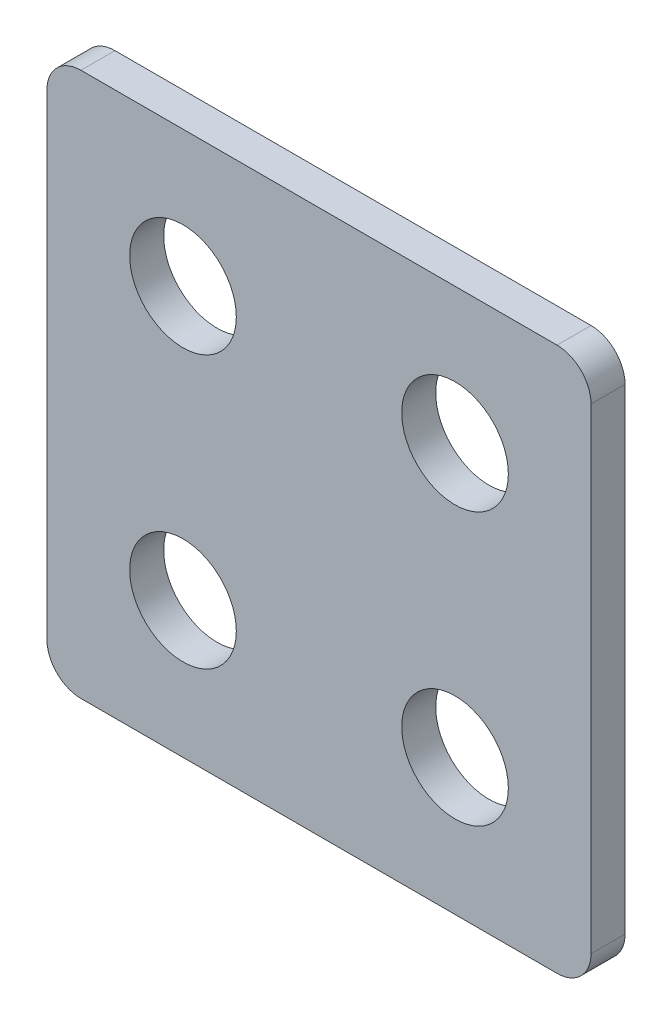
ISO-10303-21;
HEADER;
FILE_DESCRIPTION(('STEP AP214'),'2;1');
FILE_NAME('part.step','',(''),(''),'','','');
FILE_SCHEMA(('AUTOMOTIVE_DESIGN { 1 0 10303 214 1 1 1 1 }'));
ENDSEC;
DATA;
#1=APPLICATION_CONTEXT('core data for automotive mechanical design processes');
#2=APPLICATION_PROTOCOL_DEFINITION('international standard','automotive_design',2000,#1);
#3=PRODUCT_CONTEXT('',#1,'mechanical');
#4=PRODUCT('Part','Part','',(#3));
#5=PRODUCT_RELATED_PRODUCT_CATEGORY('part','',(#4));
#6=PRODUCT_DEFINITION_FORMATION('','',#4);
#7=PRODUCT_DEFINITION_CONTEXT('part definition',#1,'design');
#8=PRODUCT_DEFINITION('design','',#6,#7);
#9=PRODUCT_DEFINITION_SHAPE('','',#8);
#10=(LENGTH_UNIT() NAMED_UNIT(*) SI_UNIT(.MILLI.,.METRE.));
#11=(NAMED_UNIT(*) PLANE_ANGLE_UNIT() SI_UNIT($,.RADIAN.));
#12=(NAMED_UNIT(*) SI_UNIT($,.STERADIAN.) SOLID_ANGLE_UNIT());
#13=UNCERTAINTY_MEASURE_WITH_UNIT(LENGTH_MEASURE(1.E-05),#10,'distance_accuracy_value','');
#14=(GEOMETRIC_REPRESENTATION_CONTEXT(3) GLOBAL_UNCERTAINTY_ASSIGNED_CONTEXT((#13)) GLOBAL_UNIT_ASSIGNED_CONTEXT((#10,
#11,#12)) REPRESENTATION_CONTEXT('',''));
#15=CARTESIAN_POINT('',(0.,0.,0.));
#16=DIRECTION('',(0.,0.,1.));
#17=DIRECTION('',(1.,0.,0.));
#18=AXIS2_PLACEMENT_3D('',#15,#16,#17);
#19=CARTESIAN_POINT('',(0.,0.,1.5875));
#20=DIRECTION('',(0.,0.,1.));
#21=DIRECTION('',(1.,0.,0.));
#22=AXIS2_PLACEMENT_3D('',#19,#20,#21);
#23=PLANE('',#22);
#24=CARTESIAN_POINT('',(31.75,537.379887392973,1.5875));
#25=DIRECTION('',(0.,0.,1.));
#26=DIRECTION('',(1.,0.,0.));
#27=AXIS2_PLACEMENT_3D('',#24,#25,#26);
#28=CIRCLE('',#27,2.48919999999991);
#29=CARTESIAN_POINT('',(34.2391999999999,537.379887392973,1.5875));
#30=VERTEX_POINT('',#29);
#31=EDGE_CURVE('E185',#30,#30,#28,.T.);
#32=ORIENTED_EDGE('',*,*,#31,.F.);
#33=EDGE_LOOP('',(#32));
#34=FACE_BOUND('',#33,.T.);
#35=CARTESIAN_POINT('',(31.75,524.679887392973,1.5875));
#36=DIRECTION('',(0.,0.,1.));
#37=DIRECTION('',(1.,0.,0.));
#38=AXIS2_PLACEMENT_3D('',#35,#36,#37);
#39=CIRCLE('',#38,2.48919999999991);
#40=CARTESIAN_POINT('',(34.2391999999999,524.679887392973,1.5875));
#41=VERTEX_POINT('',#40);
#42=EDGE_CURVE('E168',#41,#41,#39,.T.);
#43=ORIENTED_EDGE('',*,*,#42,.F.);
#44=EDGE_LOOP('',(#43));
#45=FACE_BOUND('',#44,.T.);
#46=DIRECTION('',(0.,1.,0.));
#47=VECTOR('',#46,1.);
#48=CARTESIAN_POINT('',(38.1,543.729887392973,1.5875));
#49=LINE('',#48,#47);
#50=CARTESIAN_POINT('',(38.1,519.917387392973,1.5875));
#51=VERTEX_POINT('',#50);
#52=CARTESIAN_POINT('',(38.1,542.142387392973,1.5875));
#53=VERTEX_POINT('',#52);
#54=EDGE_CURVE('E175',#51,#53,#49,.T.);
#55=ORIENTED_EDGE('',*,*,#54,.T.);
#56=CARTESIAN_POINT('',(36.5125,542.142387392973,1.5875));
#57=DIRECTION('',(0.,0.,1.));
#58=DIRECTION('',(1.,0.,0.));
#59=AXIS2_PLACEMENT_3D('',#56,#57,#58);
#60=CIRCLE('',#59,1.5875);
#61=CARTESIAN_POINT('',(36.5125,543.729887392973,1.5875));
#62=VERTEX_POINT('',#61);
#63=EDGE_CURVE('E152',#53,#62,#60,.T.);
#64=ORIENTED_EDGE('',*,*,#63,.T.);
#65=DIRECTION('',(-1.,0.,0.));
#66=VECTOR('',#65,1.);
#67=CARTESIAN_POINT('',(12.7,543.729887392973,1.5875));
#68=LINE('',#67,#66);
#69=CARTESIAN_POINT('',(14.2875,543.729887392973,1.5875));
#70=VERTEX_POINT('',#69);
#71=EDGE_CURVE('E123',#62,#70,#68,.T.);
#72=ORIENTED_EDGE('',*,*,#71,.T.);
#73=CARTESIAN_POINT('',(14.2875,542.142387392973,1.5875));
#74=DIRECTION('',(0.,0.,1.));
#75=DIRECTION('',(1.,0.,0.));
#76=AXIS2_PLACEMENT_3D('',#73,#74,#75);
#77=CIRCLE('',#76,1.5875);
#78=CARTESIAN_POINT('',(12.7,542.142387392973,1.5875));
#79=VERTEX_POINT('',#78);
#80=EDGE_CURVE('E147',#70,#79,#77,.T.);
#81=ORIENTED_EDGE('',*,*,#80,.T.);
#82=DIRECTION('',(0.,-1.,0.));
#83=VECTOR('',#82,1.);
#84=CARTESIAN_POINT('',(12.7,543.729887392973,1.5875));
#85=LINE('',#84,#83);
#86=CARTESIAN_POINT('',(12.7,519.917387392973,1.5875));
#87=VERTEX_POINT('',#86);
#88=EDGE_CURVE('E130',#79,#87,#85,.T.);
#89=ORIENTED_EDGE('',*,*,#88,.T.);
#90=CARTESIAN_POINT('',(14.2875,519.917387392973,1.5875));
#91=DIRECTION('',(0.,0.,1.));
#92=DIRECTION('',(1.,0.,0.));
#93=AXIS2_PLACEMENT_3D('',#90,#91,#92);
#94=CIRCLE('',#93,1.5875);
#95=CARTESIAN_POINT('',(14.2875,518.329887392973,1.5875));
#96=VERTEX_POINT('',#95);
#97=EDGE_CURVE('E59',#87,#96,#94,.T.);
#98=ORIENTED_EDGE('',*,*,#97,.T.);
#99=DIRECTION('',(1.,0.,0.));
#100=VECTOR('',#99,1.);
#101=CARTESIAN_POINT('',(12.7,518.329887392973,1.5875));
#102=LINE('',#101,#100);
#103=CARTESIAN_POINT('',(36.5125,518.329887392973,1.5875));
#104=VERTEX_POINT('',#103);
#105=EDGE_CURVE('E133',#96,#104,#102,.T.);
#106=ORIENTED_EDGE('',*,*,#105,.T.);
#107=CARTESIAN_POINT('',(36.5125,519.917387392973,1.5875));
#108=DIRECTION('',(0.,0.,1.));
#109=DIRECTION('',(1.,0.,0.));
#110=AXIS2_PLACEMENT_3D('',#107,#108,#109);
#111=CIRCLE('',#110,1.5875);
#112=EDGE_CURVE('E150',#104,#51,#111,.T.);
#113=ORIENTED_EDGE('',*,*,#112,.T.);
#114=EDGE_LOOP('',(#55,#64,#72,#81,#89,#98,#106,#113));
#115=FACE_BOUND('',#114,.T.);
#116=CARTESIAN_POINT('',(19.05,524.679887392973,1.5875));
#117=DIRECTION('',(0.,0.,1.));
#118=DIRECTION('',(1.,0.,0.));
#119=AXIS2_PLACEMENT_3D('',#116,#117,#118);
#120=CIRCLE('',#119,2.4891999999999);
#121=CARTESIAN_POINT('',(21.5391999999999,524.679887392973,1.5875));
#122=VERTEX_POINT('',#121);
#123=EDGE_CURVE('E180',#122,#122,#120,.T.);
#124=ORIENTED_EDGE('',*,*,#123,.F.);
#125=EDGE_LOOP('',(#124));
#126=FACE_BOUND('',#125,.T.);
#127=CARTESIAN_POINT('',(19.05,537.379887392973,1.5875));
#128=DIRECTION('',(0.,0.,1.));
#129=DIRECTION('',(1.,0.,0.));
#130=AXIS2_PLACEMENT_3D('',#127,#128,#129);
#131=CIRCLE('',#130,2.4891999999999);
#132=CARTESIAN_POINT('',(21.5391999999999,537.379887392973,1.5875));
#133=VERTEX_POINT('',#132);
#134=EDGE_CURVE('E191',#133,#133,#131,.T.);
#135=ORIENTED_EDGE('',*,*,#134,.F.);
#136=EDGE_LOOP('',(#135));
#137=FACE_BOUND('',#136,.T.);
#138=ADVANCED_FACE('F37',(#34,#45,#115,#126,#137),#23,.T.);
#139=CARTESIAN_POINT('',(0.,0.,0.));
#140=DIRECTION('',(0.,0.,1.));
#141=DIRECTION('',(1.,0.,0.));
#142=AXIS2_PLACEMENT_3D('',#139,#140,#141);
#143=PLANE('',#142);
#144=DIRECTION('',(-1.,0.,0.));
#145=VECTOR('',#144,1.);
#146=CARTESIAN_POINT('',(12.7,543.729887392973,0.));
#147=LINE('',#146,#145);
#148=CARTESIAN_POINT('',(36.5125,543.729887392973,0.));
#149=VERTEX_POINT('',#148);
#150=CARTESIAN_POINT('',(14.2875,543.729887392973,0.));
#151=VERTEX_POINT('',#150);
#152=EDGE_CURVE('E120',#149,#151,#147,.T.);
#153=ORIENTED_EDGE('',*,*,#152,.F.);
#154=CARTESIAN_POINT('',(36.5125,542.142387392973,0.));
#155=DIRECTION('',(0.,0.,1.));
#156=DIRECTION('',(1.,0.,0.));
#157=AXIS2_PLACEMENT_3D('',#154,#155,#156);
#158=CIRCLE('',#157,1.5875);
#159=CARTESIAN_POINT('',(38.1,542.142387392973,0.));
#160=VERTEX_POINT('',#159);
#161=EDGE_CURVE('E103',#149,#160,#158,.F.);
#162=ORIENTED_EDGE('',*,*,#161,.T.);
#163=DIRECTION('',(0.,1.,0.));
#164=VECTOR('',#163,1.);
#165=CARTESIAN_POINT('',(38.1,543.729887392973,0.));
#166=LINE('',#165,#164);
#167=CARTESIAN_POINT('',(38.1,519.917387392973,0.));
#168=VERTEX_POINT('',#167);
#169=EDGE_CURVE('E131',#168,#160,#166,.T.);
#170=ORIENTED_EDGE('',*,*,#169,.F.);
#171=CARTESIAN_POINT('',(36.5125,519.917387392973,0.));
#172=DIRECTION('',(0.,0.,1.));
#173=DIRECTION('',(1.,0.,0.));
#174=AXIS2_PLACEMENT_3D('',#171,#172,#173);
#175=CIRCLE('',#174,1.5875);
#176=CARTESIAN_POINT('',(36.5125,518.329887392973,0.));
#177=VERTEX_POINT('',#176);
#178=EDGE_CURVE('E114',#168,#177,#175,.F.);
#179=ORIENTED_EDGE('',*,*,#178,.T.);
#180=DIRECTION('',(1.,0.,0.));
#181=VECTOR('',#180,1.);
#182=CARTESIAN_POINT('',(12.7,518.329887392973,0.));
#183=LINE('',#182,#181);
#184=CARTESIAN_POINT('',(14.2875,518.329887392973,0.));
#185=VERTEX_POINT('',#184);
#186=EDGE_CURVE('E135',#185,#177,#183,.T.);
#187=ORIENTED_EDGE('',*,*,#186,.F.);
#188=CARTESIAN_POINT('',(14.2875,519.917387392973,0.));
#189=DIRECTION('',(0.,0.,1.));
#190=DIRECTION('',(1.,0.,0.));
#191=AXIS2_PLACEMENT_3D('',#188,#189,#190);
#192=CIRCLE('',#191,1.5875);
#193=CARTESIAN_POINT('',(12.7,519.917387392973,0.));
#194=VERTEX_POINT('',#193);
#195=EDGE_CURVE('E141',#185,#194,#192,.F.);
#196=ORIENTED_EDGE('',*,*,#195,.T.);
#197=DIRECTION('',(0.,-1.,0.));
#198=VECTOR('',#197,1.);
#199=CARTESIAN_POINT('',(12.7,543.729887392973,0.));
#200=LINE('',#199,#198);
#201=CARTESIAN_POINT('',(12.7,542.142387392973,0.));
#202=VERTEX_POINT('',#201);
#203=EDGE_CURVE('E163',#202,#194,#200,.T.);
#204=ORIENTED_EDGE('',*,*,#203,.F.);
#205=CARTESIAN_POINT('',(14.2875,542.142387392973,0.));
#206=DIRECTION('',(0.,0.,1.));
#207=DIRECTION('',(1.,0.,0.));
#208=AXIS2_PLACEMENT_3D('',#205,#206,#207);
#209=CIRCLE('',#208,1.5875);
#210=EDGE_CURVE('E124',#202,#151,#209,.F.);
#211=ORIENTED_EDGE('',*,*,#210,.T.);
#212=EDGE_LOOP('',(#153,#162,#170,#179,#187,#196,#204,#211));
#213=FACE_BOUND('',#212,.T.);
#214=CARTESIAN_POINT('',(31.75,524.679887392973,0.));
#215=DIRECTION('',(0.,0.,1.));
#216=DIRECTION('',(1.,0.,0.));
#217=AXIS2_PLACEMENT_3D('',#214,#215,#216);
#218=CIRCLE('',#217,2.48919999999991);
#219=CARTESIAN_POINT('',(34.2391999999999,524.679887392973,0.));
#220=VERTEX_POINT('',#219);
#221=EDGE_CURVE('E171',#220,#220,#218,.T.);
#222=ORIENTED_EDGE('',*,*,#221,.T.);
#223=EDGE_LOOP('',(#222));
#224=FACE_BOUND('',#223,.T.);
#225=CARTESIAN_POINT('',(19.05,524.679887392973,0.));
#226=DIRECTION('',(0.,0.,1.));
#227=DIRECTION('',(1.,0.,0.));
#228=AXIS2_PLACEMENT_3D('',#225,#226,#227);
#229=CIRCLE('',#228,2.4891999999999);
#230=CARTESIAN_POINT('',(21.5391999999999,524.679887392973,0.));
#231=VERTEX_POINT('',#230);
#232=EDGE_CURVE('E182',#231,#231,#229,.T.);
#233=ORIENTED_EDGE('',*,*,#232,.T.);
#234=EDGE_LOOP('',(#233));
#235=FACE_BOUND('',#234,.T.);
#236=CARTESIAN_POINT('',(31.75,537.379887392973,0.));
#237=DIRECTION('',(0.,0.,1.));
#238=DIRECTION('',(1.,0.,0.));
#239=AXIS2_PLACEMENT_3D('',#236,#237,#238);
#240=CIRCLE('',#239,2.48919999999991);
#241=CARTESIAN_POINT('',(34.2391999999999,537.379887392973,0.));
#242=VERTEX_POINT('',#241);
#243=EDGE_CURVE('E188',#242,#242,#240,.T.);
#244=ORIENTED_EDGE('',*,*,#243,.T.);
#245=EDGE_LOOP('',(#244));
#246=FACE_BOUND('',#245,.T.);
#247=CARTESIAN_POINT('',(19.05,537.379887392973,0.));
#248=DIRECTION('',(0.,0.,1.));
#249=DIRECTION('',(1.,0.,0.));
#250=AXIS2_PLACEMENT_3D('',#247,#248,#249);
#251=CIRCLE('',#250,2.4891999999999);
#252=CARTESIAN_POINT('',(21.5391999999999,537.379887392973,0.));
#253=VERTEX_POINT('',#252);
#254=EDGE_CURVE('E194',#253,#253,#251,.T.);
#255=ORIENTED_EDGE('',*,*,#254,.T.);
#256=EDGE_LOOP('',(#255));
#257=FACE_BOUND('',#256,.T.);
#258=ADVANCED_FACE('F127',(#213,#224,#235,#246,#257),#143,.F.);
#259=CARTESIAN_POINT('',(12.7,543.729887392973,1.5875));
#260=DIRECTION('',(1.,0.,0.));
#261=DIRECTION('',(0.,0.,-1.));
#262=AXIS2_PLACEMENT_3D('',#259,#260,#261);
#263=PLANE('',#262);
#264=ORIENTED_EDGE('',*,*,#203,.T.);
#265=DIRECTION('',(0.,0.,-1.));
#266=VECTOR('',#265,1.);
#267=CARTESIAN_POINT('',(12.7,519.917387392973,1.5875));
#268=LINE('',#267,#266);
#269=EDGE_CURVE('E11',#194,#87,#268,.F.);
#270=ORIENTED_EDGE('',*,*,#269,.T.);
#271=ORIENTED_EDGE('',*,*,#88,.F.);
#272=DIRECTION('',(0.,0.,-1.));
#273=VECTOR('',#272,1.);
#274=CARTESIAN_POINT('',(12.7,542.142387392973,1.5875));
#275=LINE('',#274,#273);
#276=EDGE_CURVE('E45',#79,#202,#275,.T.);
#277=ORIENTED_EDGE('',*,*,#276,.T.);
#278=EDGE_LOOP('',(#264,#270,#271,#277));
#279=FACE_BOUND('',#278,.T.);
#280=ADVANCED_FACE('F162',(#279),#263,.F.);
#281=CARTESIAN_POINT('',(12.7,518.329887392973,1.5875));
#282=DIRECTION('',(0.,1.,0.));
#283=DIRECTION('',(0.,0.,1.));
#284=AXIS2_PLACEMENT_3D('',#281,#282,#283);
#285=PLANE('',#284);
#286=ORIENTED_EDGE('',*,*,#186,.T.);
#287=DIRECTION('',(0.,0.,-1.));
#288=VECTOR('',#287,1.);
#289=CARTESIAN_POINT('',(36.5125,518.329887392973,1.5875));
#290=LINE('',#289,#288);
#291=EDGE_CURVE('E52',#177,#104,#290,.F.);
#292=ORIENTED_EDGE('',*,*,#291,.T.);
#293=ORIENTED_EDGE('',*,*,#105,.F.);
#294=DIRECTION('',(0.,0.,-1.));
#295=VECTOR('',#294,1.);
#296=CARTESIAN_POINT('',(14.2875,518.329887392973,1.5875));
#297=LINE('',#296,#295);
#298=EDGE_CURVE('E154',#96,#185,#297,.T.);
#299=ORIENTED_EDGE('',*,*,#298,.T.);
#300=EDGE_LOOP('',(#286,#292,#293,#299));
#301=FACE_BOUND('',#300,.T.);
#302=ADVANCED_FACE('F221',(#301),#285,.F.);
#303=CARTESIAN_POINT('',(38.1,543.729887392973,1.5875));
#304=DIRECTION('',(-1.,0.,0.));
#305=DIRECTION('',(0.,0.,1.));
#306=AXIS2_PLACEMENT_3D('',#303,#304,#305);
#307=PLANE('',#306);
#308=ORIENTED_EDGE('',*,*,#169,.T.);
#309=DIRECTION('',(0.,0.,-1.));
#310=VECTOR('',#309,1.);
#311=CARTESIAN_POINT('',(38.1,542.142387392973,1.5875));
#312=LINE('',#311,#310);
#313=EDGE_CURVE('E108',#160,#53,#312,.F.);
#314=ORIENTED_EDGE('',*,*,#313,.T.);
#315=ORIENTED_EDGE('',*,*,#54,.F.);
#316=DIRECTION('',(0.,0.,-1.));
#317=VECTOR('',#316,1.);
#318=CARTESIAN_POINT('',(38.1,519.917387392973,1.5875));
#319=LINE('',#318,#317);
#320=EDGE_CURVE('E113',#51,#168,#319,.T.);
#321=ORIENTED_EDGE('',*,*,#320,.T.);
#322=EDGE_LOOP('',(#308,#314,#315,#321));
#323=FACE_BOUND('',#322,.T.);
#324=ADVANCED_FACE('F218',(#323),#307,.F.);
#325=CARTESIAN_POINT('',(12.7,543.729887392973,1.5875));
#326=DIRECTION('',(0.,-1.,0.));
#327=DIRECTION('',(0.,0.,-1.));
#328=AXIS2_PLACEMENT_3D('',#325,#326,#327);
#329=PLANE('',#328);
#330=ORIENTED_EDGE('',*,*,#71,.F.);
#331=DIRECTION('',(0.,0.,-1.));
#332=VECTOR('',#331,1.);
#333=CARTESIAN_POINT('',(36.5125,543.729887392973,1.5875));
#334=LINE('',#333,#332);
#335=EDGE_CURVE('E107',#62,#149,#334,.T.);
#336=ORIENTED_EDGE('',*,*,#335,.T.);
#337=ORIENTED_EDGE('',*,*,#152,.T.);
#338=DIRECTION('',(0.,0.,-1.));
#339=VECTOR('',#338,1.);
#340=CARTESIAN_POINT('',(14.2875,543.729887392973,1.5875));
#341=LINE('',#340,#339);
#342=EDGE_CURVE('E125',#151,#70,#341,.F.);
#343=ORIENTED_EDGE('',*,*,#342,.T.);
#344=EDGE_LOOP('',(#330,#336,#337,#343));
#345=FACE_BOUND('',#344,.T.);
#346=ADVANCED_FACE('F119',(#345),#329,.F.);
#347=CARTESIAN_POINT('',(31.75,524.679887392973,1.5875));
#348=DIRECTION('',(0.,0.,-1.));
#349=DIRECTION('',(-1.,0.,0.));
#350=AXIS2_PLACEMENT_3D('',#347,#348,#349);
#351=CYLINDRICAL_SURFACE('',#350,2.48919999999991);
#352=ORIENTED_EDGE('',*,*,#42,.T.);
#353=EDGE_LOOP('',(#352));
#354=FACE_BOUND('',#353,.T.);
#355=ORIENTED_EDGE('',*,*,#221,.F.);
#356=EDGE_LOOP('',(#355));
#357=FACE_BOUND('',#356,.T.);
#358=ADVANCED_FACE('F213',(#354,#357),#351,.F.);
#359=CARTESIAN_POINT('',(19.05,524.679887392973,1.5875));
#360=DIRECTION('',(0.,0.,-1.));
#361=DIRECTION('',(-1.,0.,0.));
#362=AXIS2_PLACEMENT_3D('',#359,#360,#361);
#363=CYLINDRICAL_SURFACE('',#362,2.4891999999999);
#364=ORIENTED_EDGE('',*,*,#123,.T.);
#365=EDGE_LOOP('',(#364));
#366=FACE_BOUND('',#365,.T.);
#367=ORIENTED_EDGE('',*,*,#232,.F.);
#368=EDGE_LOOP('',(#367));
#369=FACE_BOUND('',#368,.T.);
#370=ADVANCED_FACE('F245',(#366,#369),#363,.F.);
#371=CARTESIAN_POINT('',(31.75,537.379887392973,1.5875));
#372=DIRECTION('',(0.,0.,-1.));
#373=DIRECTION('',(-1.,0.,0.));
#374=AXIS2_PLACEMENT_3D('',#371,#372,#373);
#375=CYLINDRICAL_SURFACE('',#374,2.48919999999991);
#376=ORIENTED_EDGE('',*,*,#31,.T.);
#377=EDGE_LOOP('',(#376));
#378=FACE_BOUND('',#377,.T.);
#379=ORIENTED_EDGE('',*,*,#243,.F.);
#380=EDGE_LOOP('',(#379));
#381=FACE_BOUND('',#380,.T.);
#382=ADVANCED_FACE('F248',(#378,#381),#375,.F.);
#383=CARTESIAN_POINT('',(19.05,537.379887392973,1.5875));
#384=DIRECTION('',(0.,0.,-1.));
#385=DIRECTION('',(-1.,0.,0.));
#386=AXIS2_PLACEMENT_3D('',#383,#384,#385);
#387=CYLINDRICAL_SURFACE('',#386,2.4891999999999);
#388=ORIENTED_EDGE('',*,*,#134,.T.);
#389=EDGE_LOOP('',(#388));
#390=FACE_BOUND('',#389,.T.);
#391=ORIENTED_EDGE('',*,*,#254,.F.);
#392=EDGE_LOOP('',(#391));
#393=FACE_BOUND('',#392,.T.);
#394=ADVANCED_FACE('F200',(#390,#393),#387,.F.);
#395=CARTESIAN_POINT('',(36.5125,542.142387392973,1.5875));
#396=DIRECTION('',(0.,0.,-1.));
#397=DIRECTION('',(-1.,0.,0.));
#398=AXIS2_PLACEMENT_3D('',#395,#396,#397);
#399=CYLINDRICAL_SURFACE('',#398,1.5875);
#400=ORIENTED_EDGE('',*,*,#63,.F.);
#401=ORIENTED_EDGE('',*,*,#313,.F.);
#402=ORIENTED_EDGE('',*,*,#161,.F.);
#403=ORIENTED_EDGE('',*,*,#335,.F.);
#404=EDGE_LOOP('',(#400,#401,#402,#403));
#405=FACE_BOUND('',#404,.T.);
#406=ADVANCED_FACE('F106',(#405),#399,.T.);
#407=CARTESIAN_POINT('',(36.5125,519.917387392973,1.5875));
#408=DIRECTION('',(0.,0.,-1.));
#409=DIRECTION('',(-1.,0.,0.));
#410=AXIS2_PLACEMENT_3D('',#407,#408,#409);
#411=CYLINDRICAL_SURFACE('',#410,1.5875);
#412=ORIENTED_EDGE('',*,*,#112,.F.);
#413=ORIENTED_EDGE('',*,*,#291,.F.);
#414=ORIENTED_EDGE('',*,*,#178,.F.);
#415=ORIENTED_EDGE('',*,*,#320,.F.);
#416=EDGE_LOOP('',(#412,#413,#414,#415));
#417=FACE_BOUND('',#416,.T.);
#418=ADVANCED_FACE('F229',(#417),#411,.T.);
#419=CARTESIAN_POINT('',(14.2875,519.917387392973,1.5875));
#420=DIRECTION('',(0.,0.,-1.));
#421=DIRECTION('',(-1.,0.,0.));
#422=AXIS2_PLACEMENT_3D('',#419,#420,#421);
#423=CYLINDRICAL_SURFACE('',#422,1.5875);
#424=ORIENTED_EDGE('',*,*,#97,.F.);
#425=ORIENTED_EDGE('',*,*,#269,.F.);
#426=ORIENTED_EDGE('',*,*,#195,.F.);
#427=ORIENTED_EDGE('',*,*,#298,.F.);
#428=EDGE_LOOP('',(#424,#425,#426,#427));
#429=FACE_BOUND('',#428,.T.);
#430=ADVANCED_FACE('F231',(#429),#423,.T.);
#431=CARTESIAN_POINT('',(14.2875,542.142387392973,1.5875));
#432=DIRECTION('',(0.,0.,-1.));
#433=DIRECTION('',(-1.,0.,0.));
#434=AXIS2_PLACEMENT_3D('',#431,#432,#433);
#435=CYLINDRICAL_SURFACE('',#434,1.5875);
#436=ORIENTED_EDGE('',*,*,#80,.F.);
#437=ORIENTED_EDGE('',*,*,#342,.F.);
#438=ORIENTED_EDGE('',*,*,#210,.F.);
#439=ORIENTED_EDGE('',*,*,#276,.F.);
#440=EDGE_LOOP('',(#436,#437,#438,#439));
#441=FACE_BOUND('',#440,.T.);
#442=ADVANCED_FACE('F39',(#441),#435,.T.);
#443=CLOSED_SHELL('',(#138,#258,#280,#302,#324,#346,#358,#370,#382,#394,#406,#418,#430,#442));
#444=MANIFOLD_SOLID_BREP('B2',#443);
#445=ADVANCED_BREP_SHAPE_REPRESENTATION('',(#18,#444),#14);
#446=SHAPE_DEFINITION_REPRESENTATION(#9,#445);
ENDSEC;
END-ISO-10303-21;
